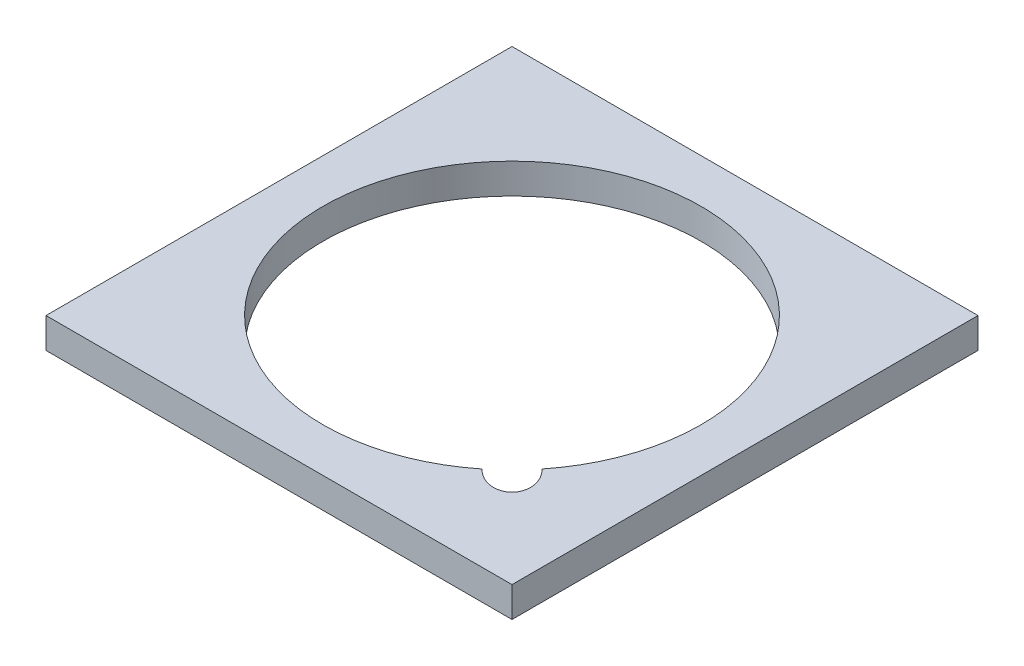
ISO-10303-21;
HEADER;
FILE_DESCRIPTION(('STEP AP214'),'2;1');
FILE_NAME('part.step','',(''),(''),'','','');
FILE_SCHEMA(('AUTOMOTIVE_DESIGN { 1 0 10303 214 1 1 1 1 }'));
ENDSEC;
DATA;
#1=APPLICATION_CONTEXT('core data for automotive mechanical design processes');
#2=APPLICATION_PROTOCOL_DEFINITION('international standard','automotive_design',2000,#1);
#3=PRODUCT_CONTEXT('',#1,'mechanical');
#4=PRODUCT('Part','Part','',(#3));
#5=PRODUCT_RELATED_PRODUCT_CATEGORY('part','',(#4));
#6=PRODUCT_DEFINITION_FORMATION('','',#4);
#7=PRODUCT_DEFINITION_CONTEXT('part definition',#1,'design');
#8=PRODUCT_DEFINITION('design','',#6,#7);
#9=PRODUCT_DEFINITION_SHAPE('','',#8);
#10=(LENGTH_UNIT() NAMED_UNIT(*) SI_UNIT(.MILLI.,.METRE.));
#11=(NAMED_UNIT(*) PLANE_ANGLE_UNIT() SI_UNIT($,.RADIAN.));
#12=(NAMED_UNIT(*) SI_UNIT($,.STERADIAN.) SOLID_ANGLE_UNIT());
#13=UNCERTAINTY_MEASURE_WITH_UNIT(LENGTH_MEASURE(1.E-05),#10,'distance_accuracy_value','');
#14=(GEOMETRIC_REPRESENTATION_CONTEXT(3) GLOBAL_UNCERTAINTY_ASSIGNED_CONTEXT((#13)) GLOBAL_UNIT_ASSIGNED_CONTEXT((#10,
#11,#12)) REPRESENTATION_CONTEXT('',''));
#15=CARTESIAN_POINT('',(0.,0.,0.));
#16=DIRECTION('',(0.,0.,1.));
#17=DIRECTION('',(1.,0.,0.));
#18=AXIS2_PLACEMENT_3D('',#15,#16,#17);
#19=CARTESIAN_POINT('',(0.,10.,-154.));
#20=DIRECTION('',(0.,-1.,0.));
#21=DIRECTION('',(0.,0.,-1.));
#22=AXIS2_PLACEMENT_3D('',#19,#20,#21);
#23=PLANE('',#22);
#24=DIRECTION('',(0.,0.,1.));
#25=VECTOR('',#24,1.);
#26=CARTESIAN_POINT('',(0.,10.,0.));
#27=LINE('',#26,#25);
#28=CARTESIAN_POINT('',(0.,10.,-154.));
#29=VERTEX_POINT('',#28);
#30=CARTESIAN_POINT('',(0.,10.,0.));
#31=VERTEX_POINT('',#30);
#32=EDGE_CURVE('E138',#29,#31,#27,.T.);
#33=ORIENTED_EDGE('',*,*,#32,.T.);
#34=DIRECTION('',(1.,0.,0.));
#35=VECTOR('',#34,1.);
#36=CARTESIAN_POINT('',(0.,10.,0.));
#37=LINE('',#36,#35);
#38=CARTESIAN_POINT('',(154.,10.,0.));
#39=VERTEX_POINT('',#38);
#40=EDGE_CURVE('E162',#31,#39,#37,.T.);
#41=ORIENTED_EDGE('',*,*,#40,.T.);
#42=DIRECTION('',(0.,0.,-1.));
#43=VECTOR('',#42,1.);
#44=CARTESIAN_POINT('',(154.,10.,0.));
#45=LINE('',#44,#43);
#46=CARTESIAN_POINT('',(154.,10.,-154.));
#47=VERTEX_POINT('',#46);
#48=EDGE_CURVE('E118',#39,#47,#45,.T.);
#49=ORIENTED_EDGE('',*,*,#48,.T.);
#50=DIRECTION('',(-1.,0.,0.));
#51=VECTOR('',#50,1.);
#52=CARTESIAN_POINT('',(0.,10.,-154.));
#53=LINE('',#52,#51);
#54=EDGE_CURVE('E114',#47,#29,#53,.T.);
#55=ORIENTED_EDGE('',*,*,#54,.T.);
#56=EDGE_LOOP('',(#33,#41,#49,#55));
#57=FACE_BOUND('',#56,.T.);
#58=CARTESIAN_POINT('',(121.194173824159,10.,-32.8058261758407));
#59=DIRECTION('',(0.,1.,0.));
#60=DIRECTION('',(0.707106781186547,0.,0.707106781186548));
#61=AXIS2_PLACEMENT_3D('',#58,#59,#60);
#62=ELLIPSE('',#61,8.99999999999999,6.99999999999999);
#63=CARTESIAN_POINT('',(115.971605193723,10.,-28.13831778761));
#64=VERTEX_POINT('',#63);
#65=CARTESIAN_POINT('',(125.86168221239,10.,-38.028394806277));
#66=VERTEX_POINT('',#65);
#67=EDGE_CURVE('E93',#64,#66,#62,.T.);
#68=ORIENTED_EDGE('',*,*,#67,.F.);
#69=CARTESIAN_POINT('',(77.,10.,-77.));
#70=DIRECTION('',(0.,1.,0.));
#71=DIRECTION('',(0.,0.,1.));
#72=AXIS2_PLACEMENT_3D('',#69,#70,#71);
#73=CIRCLE('',#72,62.5);
#74=EDGE_CURVE('E86',#66,#64,#73,.T.);
#75=ORIENTED_EDGE('',*,*,#74,.F.);
#76=EDGE_LOOP('',(#68,#75));
#77=FACE_BOUND('',#76,.T.);
#78=ADVANCED_FACE('F34',(#57,#77),#23,.F.);
#79=CARTESIAN_POINT('',(0.,0.,-154.));
#80=DIRECTION('',(0.,-1.,0.));
#81=DIRECTION('',(0.,0.,-1.));
#82=AXIS2_PLACEMENT_3D('',#79,#80,#81);
#83=PLANE('',#82);
#84=DIRECTION('',(0.,0.,1.));
#85=VECTOR('',#84,1.);
#86=CARTESIAN_POINT('',(0.,0.,0.));
#87=LINE('',#86,#85);
#88=CARTESIAN_POINT('',(0.,0.,-154.));
#89=VERTEX_POINT('',#88);
#90=CARTESIAN_POINT('',(0.,0.,0.));
#91=VERTEX_POINT('',#90);
#92=EDGE_CURVE('E121',#89,#91,#87,.T.);
#93=ORIENTED_EDGE('',*,*,#92,.F.);
#94=DIRECTION('',(-1.,0.,0.));
#95=VECTOR('',#94,1.);
#96=CARTESIAN_POINT('',(0.,0.,-154.));
#97=LINE('',#96,#95);
#98=CARTESIAN_POINT('',(154.,0.,-154.));
#99=VERTEX_POINT('',#98);
#100=EDGE_CURVE('E134',#99,#89,#97,.T.);
#101=ORIENTED_EDGE('',*,*,#100,.F.);
#102=DIRECTION('',(0.,0.,-1.));
#103=VECTOR('',#102,1.);
#104=CARTESIAN_POINT('',(154.,0.,0.));
#105=LINE('',#104,#103);
#106=CARTESIAN_POINT('',(154.,0.,0.));
#107=VERTEX_POINT('',#106);
#108=EDGE_CURVE('E139',#107,#99,#105,.T.);
#109=ORIENTED_EDGE('',*,*,#108,.F.);
#110=DIRECTION('',(1.,0.,0.));
#111=VECTOR('',#110,1.);
#112=CARTESIAN_POINT('',(0.,0.,0.));
#113=LINE('',#112,#111);
#114=EDGE_CURVE('E126',#91,#107,#113,.T.);
#115=ORIENTED_EDGE('',*,*,#114,.F.);
#116=EDGE_LOOP('',(#93,#101,#109,#115));
#117=FACE_BOUND('',#116,.T.);
#118=CARTESIAN_POINT('',(77.,0.,-77.));
#119=DIRECTION('',(0.,1.,0.));
#120=DIRECTION('',(0.,0.,1.));
#121=AXIS2_PLACEMENT_3D('',#118,#119,#120);
#122=CIRCLE('',#121,62.5);
#123=CARTESIAN_POINT('',(125.86168221239,0.,-38.028394806277));
#124=VERTEX_POINT('',#123);
#125=CARTESIAN_POINT('',(115.971605193723,0.,-28.13831778761));
#126=VERTEX_POINT('',#125);
#127=EDGE_CURVE('E97',#124,#126,#122,.T.);
#128=ORIENTED_EDGE('',*,*,#127,.T.);
#129=CARTESIAN_POINT('',(121.194173824159,0.,-32.8058261758407));
#130=DIRECTION('',(0.,1.,0.));
#131=DIRECTION('',(0.707106781186547,0.,0.707106781186548));
#132=AXIS2_PLACEMENT_3D('',#129,#130,#131);
#133=ELLIPSE('',#132,8.99999999999999,6.99999999999999);
#134=EDGE_CURVE('E56',#126,#124,#133,.T.);
#135=ORIENTED_EDGE('',*,*,#134,.T.);
#136=EDGE_LOOP('',(#128,#135));
#137=FACE_BOUND('',#136,.T.);
#138=ADVANCED_FACE('F156',(#117,#137),#83,.T.);
#139=CARTESIAN_POINT('',(0.,10.,0.));
#140=DIRECTION('',(1.,0.,0.));
#141=DIRECTION('',(0.,0.,-1.));
#142=AXIS2_PLACEMENT_3D('',#139,#140,#141);
#143=PLANE('',#142);
#144=ORIENTED_EDGE('',*,*,#92,.T.);
#145=DIRECTION('',(0.,-1.,0.));
#146=VECTOR('',#145,1.);
#147=CARTESIAN_POINT('',(0.,10.,0.));
#148=LINE('',#147,#146);
#149=EDGE_CURVE('E12',#31,#91,#148,.T.);
#150=ORIENTED_EDGE('',*,*,#149,.F.);
#151=ORIENTED_EDGE('',*,*,#32,.F.);
#152=DIRECTION('',(0.,-1.,0.));
#153=VECTOR('',#152,1.);
#154=CARTESIAN_POINT('',(0.,10.,-154.));
#155=LINE('',#154,#153);
#156=EDGE_CURVE('E117',#29,#89,#155,.T.);
#157=ORIENTED_EDGE('',*,*,#156,.T.);
#158=EDGE_LOOP('',(#144,#150,#151,#157));
#159=FACE_BOUND('',#158,.T.);
#160=ADVANCED_FACE('F36',(#159),#143,.F.);
#161=CARTESIAN_POINT('',(0.,10.,0.));
#162=DIRECTION('',(0.,0.,-1.));
#163=DIRECTION('',(-1.,0.,0.));
#164=AXIS2_PLACEMENT_3D('',#161,#162,#163);
#165=PLANE('',#164);
#166=ORIENTED_EDGE('',*,*,#114,.T.);
#167=DIRECTION('',(0.,-1.,0.));
#168=VECTOR('',#167,1.);
#169=CARTESIAN_POINT('',(154.,10.,0.));
#170=LINE('',#169,#168);
#171=EDGE_CURVE('E42',#39,#107,#170,.T.);
#172=ORIENTED_EDGE('',*,*,#171,.F.);
#173=ORIENTED_EDGE('',*,*,#40,.F.);
#174=ORIENTED_EDGE('',*,*,#149,.T.);
#175=EDGE_LOOP('',(#166,#172,#173,#174));
#176=FACE_BOUND('',#175,.T.);
#177=ADVANCED_FACE('F160',(#176),#165,.F.);
#178=CARTESIAN_POINT('',(154.,10.,0.));
#179=DIRECTION('',(-1.,0.,0.));
#180=DIRECTION('',(0.,0.,1.));
#181=AXIS2_PLACEMENT_3D('',#178,#179,#180);
#182=PLANE('',#181);
#183=ORIENTED_EDGE('',*,*,#108,.T.);
#184=DIRECTION('',(0.,-1.,0.));
#185=VECTOR('',#184,1.);
#186=CARTESIAN_POINT('',(154.,10.,-154.));
#187=LINE('',#186,#185);
#188=EDGE_CURVE('E143',#47,#99,#187,.T.);
#189=ORIENTED_EDGE('',*,*,#188,.F.);
#190=ORIENTED_EDGE('',*,*,#48,.F.);
#191=ORIENTED_EDGE('',*,*,#171,.T.);
#192=EDGE_LOOP('',(#183,#189,#190,#191));
#193=FACE_BOUND('',#192,.T.);
#194=ADVANCED_FACE('F150',(#193),#182,.F.);
#195=CARTESIAN_POINT('',(0.,10.,-154.));
#196=DIRECTION('',(0.,0.,1.));
#197=DIRECTION('',(1.,0.,0.));
#198=AXIS2_PLACEMENT_3D('',#195,#196,#197);
#199=PLANE('',#198);
#200=ORIENTED_EDGE('',*,*,#100,.T.);
#201=ORIENTED_EDGE('',*,*,#156,.F.);
#202=ORIENTED_EDGE('',*,*,#54,.F.);
#203=ORIENTED_EDGE('',*,*,#188,.T.);
#204=EDGE_LOOP('',(#200,#201,#202,#203));
#205=FACE_BOUND('',#204,.T.);
#206=ADVANCED_FACE('F169',(#205),#199,.F.);
#207=DIRECTION('',(0.,-1.,0.));
#208=VECTOR('',#207,1.);
#209=SURFACE_OF_LINEAR_EXTRUSION('',#62,#208);
#210=ORIENTED_EDGE('',*,*,#134,.F.);
#211=DIRECTION('',(0.,-1.,0.));
#212=VECTOR('',#211,1.);
#213=CARTESIAN_POINT('',(115.971605193723,10.,-28.13831778761));
#214=LINE('',#213,#212);
#215=EDGE_CURVE('E88',#64,#126,#214,.T.);
#216=ORIENTED_EDGE('',*,*,#215,.F.);
#217=ORIENTED_EDGE('',*,*,#67,.T.);
#218=DIRECTION('',(0.,-1.,0.));
#219=VECTOR('',#218,1.);
#220=CARTESIAN_POINT('',(125.86168221239,10.,-38.028394806277));
#221=LINE('',#220,#219);
#222=EDGE_CURVE('E49',#66,#124,#221,.T.);
#223=ORIENTED_EDGE('',*,*,#222,.T.);
#224=EDGE_LOOP('',(#210,#216,#217,#223));
#225=FACE_BOUND('',#224,.T.);
#226=ADVANCED_FACE('F94',(#225),#209,.T.);
#227=CARTESIAN_POINT('',(77.,10.,-77.));
#228=DIRECTION('',(0.,-1.,0.));
#229=DIRECTION('',(0.,0.,-1.));
#230=AXIS2_PLACEMENT_3D('',#227,#228,#229);
#231=CYLINDRICAL_SURFACE('',#230,62.5);
#232=ORIENTED_EDGE('',*,*,#127,.F.);
#233=ORIENTED_EDGE('',*,*,#222,.F.);
#234=ORIENTED_EDGE('',*,*,#74,.T.);
#235=ORIENTED_EDGE('',*,*,#215,.T.);
#236=EDGE_LOOP('',(#232,#233,#234,#235));
#237=FACE_BOUND('',#236,.T.);
#238=ADVANCED_FACE('F87',(#237),#231,.F.);
#239=CLOSED_SHELL('',(#78,#138,#160,#177,#194,#206,#226,#238));
#240=MANIFOLD_SOLID_BREP('B2',#239);
#241=ADVANCED_BREP_SHAPE_REPRESENTATION('',(#18,#240),#14);
#242=SHAPE_DEFINITION_REPRESENTATION(#9,#241);
ENDSEC;
END-ISO-10303-21;
